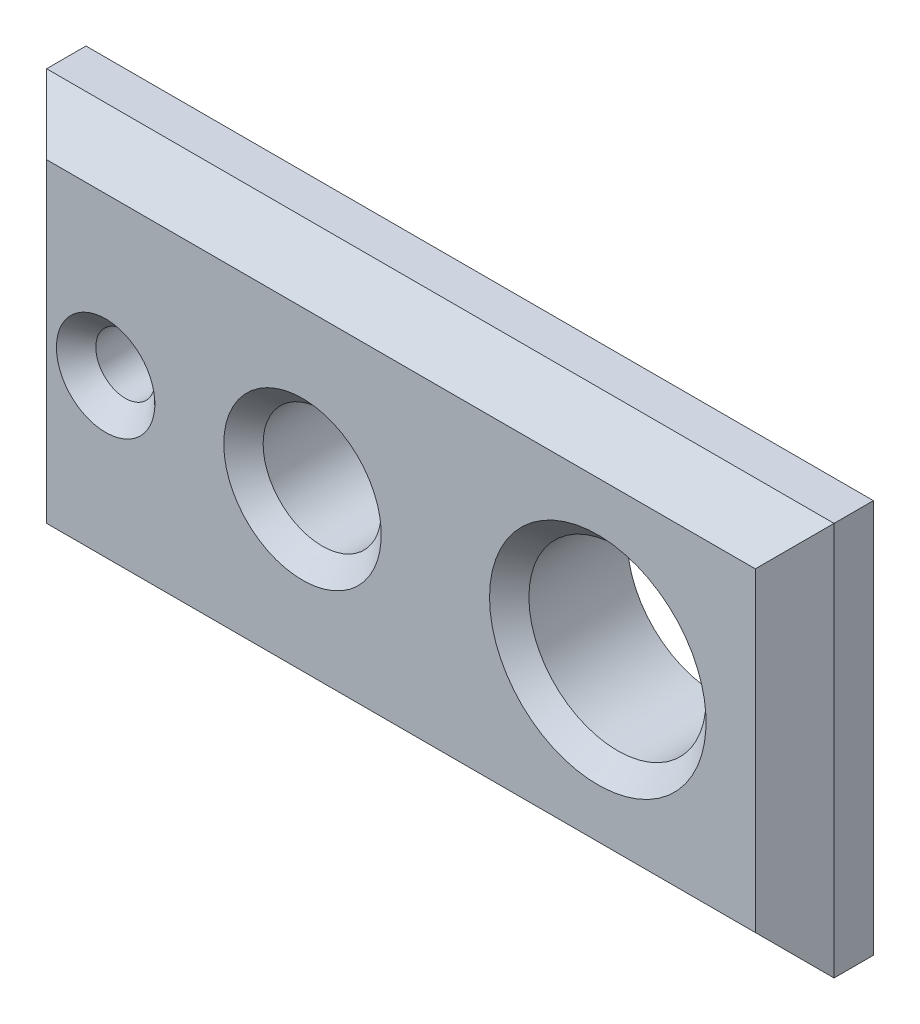
ISO-10303-21;
HEADER;
FILE_DESCRIPTION(('STEP AP214'),'2;1');
FILE_NAME('part.step','',(''),(''),'','','');
FILE_SCHEMA(('AUTOMOTIVE_DESIGN { 1 0 10303 214 1 1 1 1 }'));
ENDSEC;
DATA;
#1=APPLICATION_CONTEXT('core data for automotive mechanical design processes');
#2=APPLICATION_PROTOCOL_DEFINITION('international standard','automotive_design',2000,#1);
#3=PRODUCT_CONTEXT('',#1,'mechanical');
#4=PRODUCT('Part','Part','',(#3));
#5=PRODUCT_RELATED_PRODUCT_CATEGORY('part','',(#4));
#6=PRODUCT_DEFINITION_FORMATION('','',#4);
#7=PRODUCT_DEFINITION_CONTEXT('part definition',#1,'design');
#8=PRODUCT_DEFINITION('design','',#6,#7);
#9=PRODUCT_DEFINITION_SHAPE('','',#8);
#10=(LENGTH_UNIT() NAMED_UNIT(*) SI_UNIT(.MILLI.,.METRE.));
#11=(NAMED_UNIT(*) PLANE_ANGLE_UNIT() SI_UNIT($,.RADIAN.));
#12=(NAMED_UNIT(*) SI_UNIT($,.STERADIAN.) SOLID_ANGLE_UNIT());
#13=UNCERTAINTY_MEASURE_WITH_UNIT(LENGTH_MEASURE(1.E-05),#10,'distance_accuracy_value','');
#14=(GEOMETRIC_REPRESENTATION_CONTEXT(3) GLOBAL_UNCERTAINTY_ASSIGNED_CONTEXT((#13)) GLOBAL_UNIT_ASSIGNED_CONTEXT((#10,
#11,#12)) REPRESENTATION_CONTEXT('',''));
#15=CARTESIAN_POINT('',(0.,0.,0.));
#16=DIRECTION('',(0.,0.,1.));
#17=DIRECTION('',(1.,0.,0.));
#18=AXIS2_PLACEMENT_3D('',#15,#16,#17);
#19=CARTESIAN_POINT('',(-100.,50.,15.));
#20=DIRECTION('',(1.,0.,0.));
#21=DIRECTION('',(0.,1.,0.));
#22=AXIS2_PLACEMENT_3D('',#19,#20,#21);
#23=PLANE('',#22);
#24=DIRECTION('',(0.,0.,-1.));
#25=VECTOR('',#24,1.);
#26=CARTESIAN_POINT('',(-100.,50.,15.));
#27=LINE('',#26,#25);
#28=CARTESIAN_POINT('',(-100.,50.,4.99999999999996));
#29=VERTEX_POINT('',#28);
#30=CARTESIAN_POINT('',(-100.,50.,-4.99999999999999));
#31=VERTEX_POINT('',#30);
#32=EDGE_CURVE('E391',#29,#31,#27,.T.);
#33=ORIENTED_EDGE('',*,*,#32,.T.);
#34=DIRECTION('',(0.,-1.,0.));
#35=VECTOR('',#34,1.);
#36=CARTESIAN_POINT('',(-99.9999999999999,-50.,-4.99999999999999));
#37=LINE('',#36,#35);
#38=CARTESIAN_POINT('',(-99.9999999999999,-50.,-4.99999999999999));
#39=VERTEX_POINT('',#38);
#40=EDGE_CURVE('E422',#31,#39,#37,.T.);
#41=ORIENTED_EDGE('',*,*,#40,.T.);
#42=DIRECTION('',(0.,0.,-1.));
#43=VECTOR('',#42,1.);
#44=CARTESIAN_POINT('',(-99.9999999999999,-50.,15.));
#45=LINE('',#44,#43);
#46=CARTESIAN_POINT('',(-99.9999999999999,-50.,4.99999999999996));
#47=VERTEX_POINT('',#46);
#48=EDGE_CURVE('E129',#47,#39,#45,.T.);
#49=ORIENTED_EDGE('',*,*,#48,.F.);
#50=DIRECTION('',(0.,1.,0.));
#51=VECTOR('',#50,1.);
#52=CARTESIAN_POINT('',(-100.,50.,4.99999999999996));
#53=LINE('',#52,#51);
#54=EDGE_CURVE('E402',#47,#29,#53,.T.);
#55=ORIENTED_EDGE('',*,*,#54,.T.);
#56=EDGE_LOOP('',(#33,#41,#49,#55));
#57=FACE_BOUND('',#56,.T.);
#58=ADVANCED_FACE('F41',(#57),#23,.F.);
#59=CARTESIAN_POINT('',(100.,-50.,15.));
#60=DIRECTION('',(0.,1.,0.));
#61=DIRECTION('',(-1.,0.,0.));
#62=AXIS2_PLACEMENT_3D('',#59,#60,#61);
#63=PLANE('',#62);
#64=ORIENTED_EDGE('',*,*,#48,.T.);
#65=DIRECTION('',(1.,0.,0.));
#66=VECTOR('',#65,1.);
#67=CARTESIAN_POINT('',(100.,-50.,-4.99999999999999));
#68=LINE('',#67,#66);
#69=CARTESIAN_POINT('',(100.,-50.,-4.99999999999999));
#70=VERTEX_POINT('',#69);
#71=EDGE_CURVE('E128',#39,#70,#68,.T.);
#72=ORIENTED_EDGE('',*,*,#71,.T.);
#73=DIRECTION('',(0.,0.,-1.));
#74=VECTOR('',#73,1.);
#75=CARTESIAN_POINT('',(100.,-50.,15.));
#76=LINE('',#75,#74);
#77=CARTESIAN_POINT('',(100.,-50.,4.99999999999996));
#78=VERTEX_POINT('',#77);
#79=EDGE_CURVE('E111',#78,#70,#76,.T.);
#80=ORIENTED_EDGE('',*,*,#79,.F.);
#81=DIRECTION('',(-1.,0.,0.));
#82=VECTOR('',#81,1.);
#83=CARTESIAN_POINT('',(100.,-50.,4.99999999999996));
#84=LINE('',#83,#82);
#85=EDGE_CURVE('E125',#78,#47,#84,.T.);
#86=ORIENTED_EDGE('',*,*,#85,.T.);
#87=EDGE_LOOP('',(#64,#72,#80,#86));
#88=FACE_BOUND('',#87,.T.);
#89=ADVANCED_FACE('F124',(#88),#63,.F.);
#90=CARTESIAN_POINT('',(100.,50.,15.));
#91=DIRECTION('',(-1.,0.,0.));
#92=DIRECTION('',(0.,0.,1.));
#93=AXIS2_PLACEMENT_3D('',#90,#91,#92);
#94=PLANE('',#93);
#95=ORIENTED_EDGE('',*,*,#79,.T.);
#96=DIRECTION('',(0.,1.,0.));
#97=VECTOR('',#96,1.);
#98=CARTESIAN_POINT('',(100.,50.,-4.99999999999999));
#99=LINE('',#98,#97);
#100=CARTESIAN_POINT('',(100.,50.,-4.99999999999999));
#101=VERTEX_POINT('',#100);
#102=EDGE_CURVE('E117',#70,#101,#99,.T.);
#103=ORIENTED_EDGE('',*,*,#102,.T.);
#104=DIRECTION('',(0.,0.,-1.));
#105=VECTOR('',#104,1.);
#106=CARTESIAN_POINT('',(100.,50.,15.));
#107=LINE('',#106,#105);
#108=CARTESIAN_POINT('',(100.,50.,4.99999999999996));
#109=VERTEX_POINT('',#108);
#110=EDGE_CURVE('E113',#109,#101,#107,.T.);
#111=ORIENTED_EDGE('',*,*,#110,.F.);
#112=DIRECTION('',(0.,-1.,0.));
#113=VECTOR('',#112,1.);
#114=CARTESIAN_POINT('',(100.,50.,4.99999999999996));
#115=LINE('',#114,#113);
#116=EDGE_CURVE('E108',#109,#78,#115,.T.);
#117=ORIENTED_EDGE('',*,*,#116,.T.);
#118=EDGE_LOOP('',(#95,#103,#111,#117));
#119=FACE_BOUND('',#118,.T.);
#120=ADVANCED_FACE('F110',(#119),#94,.F.);
#121=CARTESIAN_POINT('',(100.,50.,15.));
#122=DIRECTION('',(0.,-1.,0.));
#123=DIRECTION('',(1.,0.,0.));
#124=AXIS2_PLACEMENT_3D('',#121,#122,#123);
#125=PLANE('',#124);
#126=ORIENTED_EDGE('',*,*,#110,.T.);
#127=DIRECTION('',(-1.,0.,0.));
#128=VECTOR('',#127,1.);
#129=CARTESIAN_POINT('',(-100.,50.,-4.99999999999999));
#130=LINE('',#129,#128);
#131=EDGE_CURVE('E388',#101,#31,#130,.T.);
#132=ORIENTED_EDGE('',*,*,#131,.T.);
#133=ORIENTED_EDGE('',*,*,#32,.F.);
#134=DIRECTION('',(1.,0.,0.));
#135=VECTOR('',#134,1.);
#136=CARTESIAN_POINT('',(100.,50.,4.99999999999996));
#137=LINE('',#136,#135);
#138=EDGE_CURVE('E390',#29,#109,#137,.T.);
#139=ORIENTED_EDGE('',*,*,#138,.T.);
#140=EDGE_LOOP('',(#126,#132,#133,#139));
#141=FACE_BOUND('',#140,.T.);
#142=ADVANCED_FACE('F287',(#141),#125,.F.);
#143=CARTESIAN_POINT('',(0.,0.,15.));
#144=DIRECTION('',(0.,0.,-1.));
#145=DIRECTION('',(-1.,0.,0.));
#146=AXIS2_PLACEMENT_3D('',#143,#144,#145);
#147=PLANE('',#146);
#148=CARTESIAN_POINT('',(50.,0.,15.));
#149=DIRECTION('',(0.,0.,-1.));
#150=DIRECTION('',(-1.,0.,0.));
#151=AXIS2_PLACEMENT_3D('',#148,#149,#150);
#152=CIRCLE('',#151,27.5);
#153=CARTESIAN_POINT('',(22.5,0.,15.));
#154=VERTEX_POINT('',#153);
#155=EDGE_CURVE('E158',#154,#154,#152,.T.);
#156=ORIENTED_EDGE('',*,*,#155,.T.);
#157=EDGE_LOOP('',(#156));
#158=FACE_BOUND('',#157,.T.);
#159=CARTESIAN_POINT('',(-25.,0.,15.));
#160=DIRECTION('',(0.,0.,-1.));
#161=DIRECTION('',(-1.,0.,0.));
#162=AXIS2_PLACEMENT_3D('',#159,#160,#161);
#163=CIRCLE('',#162,20.);
#164=CARTESIAN_POINT('',(-45.,0.,15.));
#165=VERTEX_POINT('',#164);
#166=EDGE_CURVE('E155',#165,#165,#163,.T.);
#167=ORIENTED_EDGE('',*,*,#166,.T.);
#168=EDGE_LOOP('',(#167));
#169=FACE_BOUND('',#168,.T.);
#170=CARTESIAN_POINT('',(-75.,0.,15.));
#171=DIRECTION('',(0.,0.,-1.));
#172=DIRECTION('',(-1.,0.,0.));
#173=AXIS2_PLACEMENT_3D('',#170,#171,#172);
#174=CIRCLE('',#173,12.5);
#175=CARTESIAN_POINT('',(-87.5,0.,15.));
#176=VERTEX_POINT('',#175);
#177=EDGE_CURVE('E151',#176,#176,#174,.T.);
#178=ORIENTED_EDGE('',*,*,#177,.T.);
#179=EDGE_LOOP('',(#178));
#180=FACE_BOUND('',#179,.T.);
#181=DIRECTION('',(0.,1.,0.));
#182=VECTOR('',#181,1.);
#183=CARTESIAN_POINT('',(90.0000000000001,0.,15.));
#184=LINE('',#183,#182);
#185=CARTESIAN_POINT('',(90.0000000000001,-40.,15.));
#186=VERTEX_POINT('',#185);
#187=CARTESIAN_POINT('',(90.0000000000001,40.,15.));
#188=VERTEX_POINT('',#187);
#189=EDGE_CURVE('E57',#186,#188,#184,.T.);
#190=ORIENTED_EDGE('',*,*,#189,.T.);
#191=DIRECTION('',(-1.,0.,0.));
#192=VECTOR('',#191,1.);
#193=CARTESIAN_POINT('',(0.,40.,15.));
#194=LINE('',#193,#192);
#195=CARTESIAN_POINT('',(-90.,40.,15.));
#196=VERTEX_POINT('',#195);
#197=EDGE_CURVE('E152',#188,#196,#194,.T.);
#198=ORIENTED_EDGE('',*,*,#197,.T.);
#199=DIRECTION('',(0.,-1.,0.));
#200=VECTOR('',#199,1.);
#201=CARTESIAN_POINT('',(-90.,0.,15.));
#202=LINE('',#201,#200);
#203=CARTESIAN_POINT('',(-90.,-40.,15.));
#204=VERTEX_POINT('',#203);
#205=EDGE_CURVE('E420',#196,#204,#202,.T.);
#206=ORIENTED_EDGE('',*,*,#205,.T.);
#207=DIRECTION('',(1.,0.,0.));
#208=VECTOR('',#207,1.);
#209=CARTESIAN_POINT('',(0.,-40.,15.));
#210=LINE('',#209,#208);
#211=EDGE_CURVE('E62',#204,#186,#210,.T.);
#212=ORIENTED_EDGE('',*,*,#211,.T.);
#213=EDGE_LOOP('',(#190,#198,#206,#212));
#214=FACE_BOUND('',#213,.T.);
#215=ADVANCED_FACE('F277',(#158,#169,#180,#214),#147,.F.);
#216=CARTESIAN_POINT('',(0.,0.,-15.));
#217=DIRECTION('',(0.,0.,-1.));
#218=DIRECTION('',(-1.,0.,0.));
#219=AXIS2_PLACEMENT_3D('',#216,#217,#218);
#220=PLANE('',#219);
#221=CARTESIAN_POINT('',(-75.,0.,-15.));
#222=DIRECTION('',(0.,0.,1.));
#223=DIRECTION('',(1.,0.,0.));
#224=AXIS2_PLACEMENT_3D('',#221,#222,#223);
#225=CIRCLE('',#224,7.50000000000001);
#226=CARTESIAN_POINT('',(-67.4999999999999,0.,-15.));
#227=VERTEX_POINT('',#226);
#228=EDGE_CURVE('E412',#227,#227,#225,.T.);
#229=ORIENTED_EDGE('',*,*,#228,.T.);
#230=EDGE_LOOP('',(#229));
#231=FACE_BOUND('',#230,.T.);
#232=CARTESIAN_POINT('',(-25.,0.,-15.));
#233=DIRECTION('',(0.,0.,1.));
#234=DIRECTION('',(1.,0.,0.));
#235=AXIS2_PLACEMENT_3D('',#232,#233,#234);
#236=CIRCLE('',#235,15.);
#237=CARTESIAN_POINT('',(-9.99999999999995,0.,-15.));
#238=VERTEX_POINT('',#237);
#239=EDGE_CURVE('E440',#238,#238,#236,.T.);
#240=ORIENTED_EDGE('',*,*,#239,.T.);
#241=EDGE_LOOP('',(#240));
#242=FACE_BOUND('',#241,.T.);
#243=CARTESIAN_POINT('',(50.,0.,-15.));
#244=DIRECTION('',(0.,0.,1.));
#245=DIRECTION('',(1.,0.,0.));
#246=AXIS2_PLACEMENT_3D('',#243,#244,#245);
#247=CIRCLE('',#246,22.5);
#248=CARTESIAN_POINT('',(72.5,0.,-15.));
#249=VERTEX_POINT('',#248);
#250=EDGE_CURVE('E437',#249,#249,#247,.T.);
#251=ORIENTED_EDGE('',*,*,#250,.T.);
#252=EDGE_LOOP('',(#251));
#253=FACE_BOUND('',#252,.T.);
#254=DIRECTION('',(0.,-1.,0.));
#255=VECTOR('',#254,1.);
#256=CARTESIAN_POINT('',(90.,-50.,-15.));
#257=LINE('',#256,#255);
#258=CARTESIAN_POINT('',(90.,40.,-15.));
#259=VERTEX_POINT('',#258);
#260=CARTESIAN_POINT('',(90.,-39.9999999999999,-15.));
#261=VERTEX_POINT('',#260);
#262=EDGE_CURVE('E406',#259,#261,#257,.T.);
#263=ORIENTED_EDGE('',*,*,#262,.T.);
#264=DIRECTION('',(-1.,0.,0.));
#265=VECTOR('',#264,1.);
#266=CARTESIAN_POINT('',(-99.9999999999999,-40.,-15.));
#267=LINE('',#266,#265);
#268=CARTESIAN_POINT('',(-89.9999999999999,-40.,-15.));
#269=VERTEX_POINT('',#268);
#270=EDGE_CURVE('E118',#261,#269,#267,.T.);
#271=ORIENTED_EDGE('',*,*,#270,.T.);
#272=DIRECTION('',(0.,1.,0.));
#273=VECTOR('',#272,1.);
#274=CARTESIAN_POINT('',(-89.9999999999999,50.,-15.));
#275=LINE('',#274,#273);
#276=CARTESIAN_POINT('',(-89.9999999999999,40.,-15.));
#277=VERTEX_POINT('',#276);
#278=EDGE_CURVE('E432',#269,#277,#275,.T.);
#279=ORIENTED_EDGE('',*,*,#278,.T.);
#280=DIRECTION('',(1.,0.,0.));
#281=VECTOR('',#280,1.);
#282=CARTESIAN_POINT('',(100.,40.,-15.));
#283=LINE('',#282,#281);
#284=EDGE_CURVE('E430',#277,#259,#283,.T.);
#285=ORIENTED_EDGE('',*,*,#284,.T.);
#286=EDGE_LOOP('',(#263,#271,#279,#285));
#287=FACE_BOUND('',#286,.T.);
#288=ADVANCED_FACE('F218',(#231,#242,#253,#287),#220,.T.);
#289=CARTESIAN_POINT('',(100.,50.,-4.99999999999999));
#290=DIRECTION('',(0.,0.707106781186547,-0.707106781186549));
#291=DIRECTION('',(1.,0.,0.));
#292=AXIS2_PLACEMENT_3D('',#289,#290,#291);
#293=PLANE('',#292);
#294=DIRECTION('',(-0.577350269189626,-0.577350269189626,-0.577350269189625));
#295=VECTOR('',#294,1.);
#296=CARTESIAN_POINT('',(100.,50.,-4.99999999999999));
#297=LINE('',#296,#295);
#298=EDGE_CURVE('E397',#259,#101,#297,.F.);
#299=ORIENTED_EDGE('',*,*,#298,.F.);
#300=ORIENTED_EDGE('',*,*,#284,.F.);
#301=DIRECTION('',(0.577350269189627,-0.577350269189626,-0.577350269189625));
#302=VECTOR('',#301,1.);
#303=CARTESIAN_POINT('',(-100.,50.,-4.99999999999999));
#304=LINE('',#303,#302);
#305=EDGE_CURVE('E400',#31,#277,#304,.T.);
#306=ORIENTED_EDGE('',*,*,#305,.F.);
#307=ORIENTED_EDGE('',*,*,#131,.F.);
#308=EDGE_LOOP('',(#299,#300,#306,#307));
#309=FACE_BOUND('',#308,.T.);
#310=ADVANCED_FACE('F212',(#309),#293,.T.);
#311=CARTESIAN_POINT('',(-100.,50.,-4.99999999999999));
#312=DIRECTION('',(-0.707106781186546,0.,-0.707106781186549));
#313=DIRECTION('',(0.,1.,0.));
#314=AXIS2_PLACEMENT_3D('',#311,#312,#313);
#315=PLANE('',#314);
#316=ORIENTED_EDGE('',*,*,#305,.T.);
#317=ORIENTED_EDGE('',*,*,#278,.F.);
#318=DIRECTION('',(-0.577350269189627,-0.577350269189626,0.577350269189625));
#319=VECTOR('',#318,1.);
#320=CARTESIAN_POINT('',(-66.6666666666666,-16.6666666666666,-38.3333333333333));
#321=LINE('',#320,#319);
#322=EDGE_CURVE('E142',#39,#269,#321,.F.);
#323=ORIENTED_EDGE('',*,*,#322,.F.);
#324=ORIENTED_EDGE('',*,*,#40,.F.);
#325=EDGE_LOOP('',(#316,#317,#323,#324));
#326=FACE_BOUND('',#325,.T.);
#327=ADVANCED_FACE('F205',(#326),#315,.T.);
#328=CARTESIAN_POINT('',(100.,50.,-4.99999999999999));
#329=DIRECTION('',(0.707106781186547,0.,-0.707106781186549));
#330=DIRECTION('',(0.,-1.,0.));
#331=AXIS2_PLACEMENT_3D('',#328,#329,#330);
#332=PLANE('',#331);
#333=ORIENTED_EDGE('',*,*,#298,.T.);
#334=ORIENTED_EDGE('',*,*,#102,.F.);
#335=DIRECTION('',(-0.577350269189626,0.577350269189626,-0.577350269189625));
#336=VECTOR('',#335,1.);
#337=CARTESIAN_POINT('',(66.6666666666667,-16.6666666666666,-38.3333333333333));
#338=LINE('',#337,#336);
#339=EDGE_CURVE('E140',#261,#70,#338,.F.);
#340=ORIENTED_EDGE('',*,*,#339,.F.);
#341=ORIENTED_EDGE('',*,*,#262,.F.);
#342=EDGE_LOOP('',(#333,#334,#340,#341));
#343=FACE_BOUND('',#342,.T.);
#344=ADVANCED_FACE('F198',(#343),#332,.T.);
#345=CARTESIAN_POINT('',(100.,-50.,-4.99999999999999));
#346=DIRECTION('',(0.,-0.707106781186547,-0.707106781186548));
#347=DIRECTION('',(-1.,0.,0.));
#348=AXIS2_PLACEMENT_3D('',#345,#346,#347);
#349=PLANE('',#348);
#350=ORIENTED_EDGE('',*,*,#322,.T.);
#351=ORIENTED_EDGE('',*,*,#270,.F.);
#352=ORIENTED_EDGE('',*,*,#339,.T.);
#353=ORIENTED_EDGE('',*,*,#71,.F.);
#354=EDGE_LOOP('',(#350,#351,#352,#353));
#355=FACE_BOUND('',#354,.T.);
#356=ADVANCED_FACE('F191',(#355),#349,.T.);
#357=CARTESIAN_POINT('',(0.,-40.,15.));
#358=DIRECTION('',(0.,0.70710678118655,-0.707106781186545));
#359=DIRECTION('',(1.,0.,0.));
#360=AXIS2_PLACEMENT_3D('',#357,#358,#359);
#361=PLANE('',#360);
#362=DIRECTION('',(0.577350269189625,0.577350269189625,0.577350269189628));
#363=VECTOR('',#362,1.);
#364=CARTESIAN_POINT('',(-76.6666666666667,-26.6666666666668,28.3333333333334));
#365=LINE('',#364,#363);
#366=EDGE_CURVE('E136',#47,#204,#365,.T.);
#367=ORIENTED_EDGE('',*,*,#366,.F.);
#368=ORIENTED_EDGE('',*,*,#85,.F.);
#369=DIRECTION('',(-0.577350269189625,0.577350269189625,0.577350269189628));
#370=VECTOR('',#369,1.);
#371=CARTESIAN_POINT('',(60.0000000000002,-10.0000000000001,45.0000000000001));
#372=LINE('',#371,#370);
#373=EDGE_CURVE('E134',#186,#78,#372,.F.);
#374=ORIENTED_EDGE('',*,*,#373,.F.);
#375=ORIENTED_EDGE('',*,*,#211,.F.);
#376=EDGE_LOOP('',(#367,#368,#374,#375));
#377=FACE_BOUND('',#376,.T.);
#378=ADVANCED_FACE('F133',(#377),#361,.F.);
#379=CARTESIAN_POINT('',(90.0000000000001,0.,15.));
#380=DIRECTION('',(-0.707106781186549,0.,-0.707106781186545));
#381=DIRECTION('',(0.,1.,0.));
#382=AXIS2_PLACEMENT_3D('',#379,#380,#381);
#383=PLANE('',#382);
#384=ORIENTED_EDGE('',*,*,#373,.T.);
#385=ORIENTED_EDGE('',*,*,#116,.F.);
#386=DIRECTION('',(-0.577350269189625,-0.577350269189625,0.577350269189628));
#387=VECTOR('',#386,1.);
#388=CARTESIAN_POINT('',(76.6666666666668,26.6666666666667,28.3333333333334));
#389=LINE('',#388,#387);
#390=EDGE_CURVE('E144',#188,#109,#389,.F.);
#391=ORIENTED_EDGE('',*,*,#390,.F.);
#392=ORIENTED_EDGE('',*,*,#189,.F.);
#393=EDGE_LOOP('',(#384,#385,#391,#392));
#394=FACE_BOUND('',#393,.T.);
#395=ADVANCED_FACE('F139',(#394),#383,.F.);
#396=CARTESIAN_POINT('',(-90.,0.,15.));
#397=DIRECTION('',(0.707106781186549,0.,-0.707106781186546));
#398=DIRECTION('',(0.,-1.,0.));
#399=AXIS2_PLACEMENT_3D('',#396,#397,#398);
#400=PLANE('',#399);
#401=ORIENTED_EDGE('',*,*,#366,.T.);
#402=ORIENTED_EDGE('',*,*,#205,.F.);
#403=DIRECTION('',(-0.577350269189625,0.577350269189624,-0.577350269189628));
#404=VECTOR('',#403,1.);
#405=CARTESIAN_POINT('',(-76.6666666666667,26.6666666666667,28.3333333333334));
#406=LINE('',#405,#404);
#407=EDGE_CURVE('E411',#29,#196,#406,.F.);
#408=ORIENTED_EDGE('',*,*,#407,.F.);
#409=ORIENTED_EDGE('',*,*,#54,.F.);
#410=EDGE_LOOP('',(#401,#402,#408,#409));
#411=FACE_BOUND('',#410,.T.);
#412=ADVANCED_FACE('F229',(#411),#400,.F.);
#413=CARTESIAN_POINT('',(0.,40.,15.));
#414=DIRECTION('',(0.,-0.707106781186549,-0.707106781186545));
#415=DIRECTION('',(-1.,0.,0.));
#416=AXIS2_PLACEMENT_3D('',#413,#414,#415);
#417=PLANE('',#416);
#418=ORIENTED_EDGE('',*,*,#390,.T.);
#419=ORIENTED_EDGE('',*,*,#138,.F.);
#420=ORIENTED_EDGE('',*,*,#407,.T.);
#421=ORIENTED_EDGE('',*,*,#197,.F.);
#422=EDGE_LOOP('',(#418,#419,#420,#421));
#423=FACE_BOUND('',#422,.T.);
#424=ADVANCED_FACE('F221',(#423),#417,.F.);
#425=CARTESIAN_POINT('',(50.,0.,-15.));
#426=DIRECTION('',(0.,0.,1.));
#427=DIRECTION('',(1.,0.,0.));
#428=AXIS2_PLACEMENT_3D('',#425,#426,#427);
#429=CYLINDRICAL_SURFACE('',#428,22.5);
#430=CARTESIAN_POINT('',(50.,0.,9.99999999999997));
#431=DIRECTION('',(0.,0.,-1.));
#432=DIRECTION('',(-1.,0.,0.));
#433=AXIS2_PLACEMENT_3D('',#430,#431,#432);
#434=CIRCLE('',#433,22.5);
#435=CARTESIAN_POINT('',(27.5,0.,9.99999999999997));
#436=VERTEX_POINT('',#435);
#437=EDGE_CURVE('E148',#436,#436,#434,.F.);
#438=ORIENTED_EDGE('',*,*,#437,.T.);
#439=EDGE_LOOP('',(#438));
#440=FACE_BOUND('',#439,.T.);
#441=ORIENTED_EDGE('',*,*,#250,.F.);
#442=EDGE_LOOP('',(#441));
#443=FACE_BOUND('',#442,.T.);
#444=ADVANCED_FACE('F228',(#440,#443),#429,.F.);
#445=CARTESIAN_POINT('',(-25.,0.,-15.));
#446=DIRECTION('',(0.,0.,1.));
#447=DIRECTION('',(1.,0.,0.));
#448=AXIS2_PLACEMENT_3D('',#445,#446,#447);
#449=CYLINDRICAL_SURFACE('',#448,15.);
#450=CARTESIAN_POINT('',(-25.,0.,9.99999999999995));
#451=DIRECTION('',(0.,0.,-1.));
#452=DIRECTION('',(-1.,0.,0.));
#453=AXIS2_PLACEMENT_3D('',#450,#451,#452);
#454=CIRCLE('',#453,15.);
#455=CARTESIAN_POINT('',(-40.,0.,9.99999999999995));
#456=VERTEX_POINT('',#455);
#457=EDGE_CURVE('E50',#456,#456,#454,.F.);
#458=ORIENTED_EDGE('',*,*,#457,.T.);
#459=EDGE_LOOP('',(#458));
#460=FACE_BOUND('',#459,.T.);
#461=ORIENTED_EDGE('',*,*,#239,.F.);
#462=EDGE_LOOP('',(#461));
#463=FACE_BOUND('',#462,.T.);
#464=ADVANCED_FACE('F163',(#460,#463),#449,.F.);
#465=CARTESIAN_POINT('',(-75.,0.,-15.));
#466=DIRECTION('',(0.,0.,1.));
#467=DIRECTION('',(1.,0.,0.));
#468=AXIS2_PLACEMENT_3D('',#465,#466,#467);
#469=CYLINDRICAL_SURFACE('',#468,7.50000000000001);
#470=CARTESIAN_POINT('',(-75.,0.,10.));
#471=DIRECTION('',(0.,0.,-1.));
#472=DIRECTION('',(-1.,0.,0.));
#473=AXIS2_PLACEMENT_3D('',#470,#471,#472);
#474=CIRCLE('',#473,7.50000000000001);
#475=CARTESIAN_POINT('',(-82.5,0.,10.));
#476=VERTEX_POINT('',#475);
#477=EDGE_CURVE('E11',#476,#476,#474,.F.);
#478=ORIENTED_EDGE('',*,*,#477,.T.);
#479=EDGE_LOOP('',(#478));
#480=FACE_BOUND('',#479,.T.);
#481=ORIENTED_EDGE('',*,*,#228,.F.);
#482=EDGE_LOOP('',(#481));
#483=FACE_BOUND('',#482,.T.);
#484=ADVANCED_FACE('F175',(#480,#483),#469,.F.);
#485=CARTESIAN_POINT('',(50.,0.,9.99999999999997));
#486=DIRECTION('',(0.,0.,1.));
#487=DIRECTION('',(1.,0.,0.));
#488=AXIS2_PLACEMENT_3D('',#485,#486,#487);
#489=CONICAL_SURFACE('',#488,22.5,0.785398163397448);
#490=ORIENTED_EDGE('',*,*,#155,.F.);
#491=EDGE_LOOP('',(#490));
#492=FACE_BOUND('',#491,.T.);
#493=ORIENTED_EDGE('',*,*,#437,.F.);
#494=EDGE_LOOP('',(#493));
#495=FACE_BOUND('',#494,.T.);
#496=ADVANCED_FACE('F168',(#492,#495),#489,.F.);
#497=CARTESIAN_POINT('',(-25.,0.,9.99999999999995));
#498=DIRECTION('',(0.,0.,1.));
#499=DIRECTION('',(1.,0.,0.));
#500=AXIS2_PLACEMENT_3D('',#497,#498,#499);
#501=CONICAL_SURFACE('',#500,15.,0.785398163397448);
#502=ORIENTED_EDGE('',*,*,#166,.F.);
#503=EDGE_LOOP('',(#502));
#504=FACE_BOUND('',#503,.T.);
#505=ORIENTED_EDGE('',*,*,#457,.F.);
#506=EDGE_LOOP('',(#505));
#507=FACE_BOUND('',#506,.T.);
#508=ADVANCED_FACE('F166',(#504,#507),#501,.F.);
#509=CARTESIAN_POINT('',(-75.,0.,10.));
#510=DIRECTION('',(0.,0.,1.));
#511=DIRECTION('',(1.,0.,0.));
#512=AXIS2_PLACEMENT_3D('',#509,#510,#511);
#513=CONICAL_SURFACE('',#512,7.50000000000001,0.785398163397451);
#514=ORIENTED_EDGE('',*,*,#177,.F.);
#515=EDGE_LOOP('',(#514));
#516=FACE_BOUND('',#515,.T.);
#517=ORIENTED_EDGE('',*,*,#477,.F.);
#518=EDGE_LOOP('',(#517));
#519=FACE_BOUND('',#518,.T.);
#520=ADVANCED_FACE('F44',(#516,#519),#513,.F.);
#521=CLOSED_SHELL('',(#58,#89,#120,#142,#215,#288,#310,#327,#344,#356,#378,#395,#412,#424,#444,
#464,#484,#496,#508,#520));
#522=MANIFOLD_SOLID_BREP('B2',#521);
#523=ADVANCED_BREP_SHAPE_REPRESENTATION('',(#18,#522),#14);
#524=SHAPE_DEFINITION_REPRESENTATION(#9,#523);
ENDSEC;
END-ISO-10303-21;
